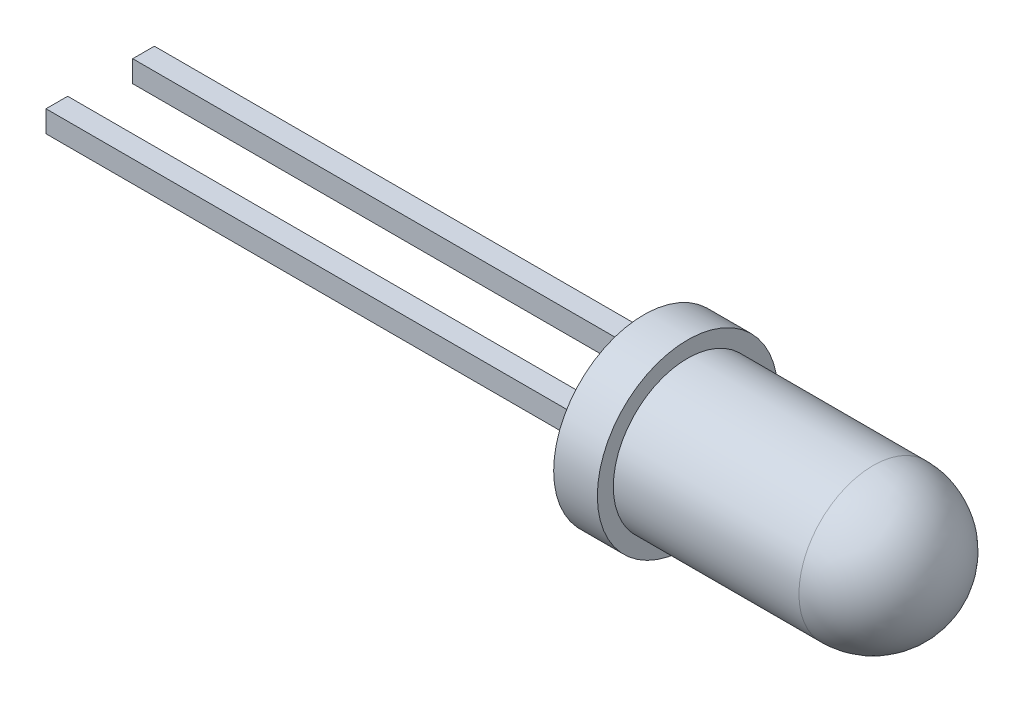
ISO-10303-21;
HEADER;
FILE_DESCRIPTION(('STEP AP214'),'2;1');
FILE_NAME('part.step','',(''),(''),'','','');
FILE_SCHEMA(('AUTOMOTIVE_DESIGN { 1 0 10303 214 1 1 1 1 }'));
ENDSEC;
DATA;
#1=APPLICATION_CONTEXT('core data for automotive mechanical design processes');
#2=APPLICATION_PROTOCOL_DEFINITION('international standard','automotive_design',2000,#1);
#3=PRODUCT_CONTEXT('',#1,'mechanical');
#4=PRODUCT('Part','Part','',(#3));
#5=PRODUCT_RELATED_PRODUCT_CATEGORY('part','',(#4));
#6=PRODUCT_DEFINITION_FORMATION('','',#4);
#7=PRODUCT_DEFINITION_CONTEXT('part definition',#1,'design');
#8=PRODUCT_DEFINITION('design','',#6,#7);
#9=PRODUCT_DEFINITION_SHAPE('','',#8);
#10=(LENGTH_UNIT() NAMED_UNIT(*) SI_UNIT(.MILLI.,.METRE.));
#11=(NAMED_UNIT(*) PLANE_ANGLE_UNIT() SI_UNIT($,.RADIAN.));
#12=(NAMED_UNIT(*) SI_UNIT($,.STERADIAN.) SOLID_ANGLE_UNIT());
#13=UNCERTAINTY_MEASURE_WITH_UNIT(LENGTH_MEASURE(1.E-05),#10,'distance_accuracy_value','');
#14=(GEOMETRIC_REPRESENTATION_CONTEXT(3) GLOBAL_UNCERTAINTY_ASSIGNED_CONTEXT((#13)) GLOBAL_UNIT_ASSIGNED_CONTEXT((#10,
#11,#12)) REPRESENTATION_CONTEXT('',''));
#15=CARTESIAN_POINT('',(0.,0.,0.));
#16=DIRECTION('',(0.,0.,1.));
#17=DIRECTION('',(1.,0.,0.));
#18=AXIS2_PLACEMENT_3D('',#15,#16,#17);
#19=CARTESIAN_POINT('',(36.9246378551169,127.506480985467,120.126510111259));
#20=DIRECTION('',(1.,0.,0.));
#21=DIRECTION('',(0.,0.,-1.));
#22=AXIS2_PLACEMENT_3D('',#19,#20,#21);
#23=PLANE('',#22);
#24=CARTESIAN_POINT('',(36.9246378551169,127.506480985467,119.215722179506));
#25=DIRECTION('',(-1.,0.,0.));
#26=DIRECTION('',(0.,0.,1.));
#27=AXIS2_PLACEMENT_3D('',#24,#25,#26);
#28=CIRCLE('',#27,1.82157586350626);
#29=CARTESIAN_POINT('',(36.9246378551169,127.506480985467,121.037298043012));
#30=VERTEX_POINT('',#29);
#31=EDGE_CURVE('P0_E19',#30,#30,#28,.F.);
#32=ORIENTED_EDGE('',*,*,#31,.F.);
#33=EDGE_LOOP('',(#32));
#34=FACE_BOUND('',#33,.T.);
#35=ADVANCED_FACE('P0_F16',(#34),#23,.F.);
#36=CARTESIAN_POINT('',(37.3657203700618,127.506480985467,119.215722179506));
#37=DIRECTION('',(-1.,0.,0.));
#38=DIRECTION('',(0.,0.,1.));
#39=AXIS2_PLACEMENT_3D('',#36,#37,#38);
#40=CYLINDRICAL_SURFACE('',#39,1.82157586350626);
#41=CARTESIAN_POINT('',(37.8068028850068,127.506480985467,119.215722179506));
#42=DIRECTION('',(-1.,0.,0.));
#43=DIRECTION('',(0.,0.,1.));
#44=AXIS2_PLACEMENT_3D('',#41,#42,#43);
#45=CIRCLE('',#44,1.82157586350626);
#46=CARTESIAN_POINT('',(37.8068028850068,127.506480985467,121.037298043012));
#47=VERTEX_POINT('',#46);
#48=EDGE_CURVE('P0_E40',#47,#47,#45,.T.);
#49=ORIENTED_EDGE('',*,*,#48,.T.);
#50=EDGE_LOOP('',(#49));
#51=FACE_BOUND('',#50,.T.);
#52=ORIENTED_EDGE('',*,*,#31,.T.);
#53=EDGE_LOOP('',(#52));
#54=FACE_BOUND('',#53,.T.);
#55=ADVANCED_FACE('P0_F53',(#51,#54),#40,.T.);
#56=CARTESIAN_POINT('',(37.8068028850068,127.506480985467,120.876048242794));
#57=DIRECTION('',(-1.,0.,0.));
#58=DIRECTION('',(0.,0.,1.));
#59=AXIS2_PLACEMENT_3D('',#56,#57,#58);
#60=PLANE('',#59);
#61=CARTESIAN_POINT('',(37.8068028850068,127.506480985467,119.215722179506));
#62=DIRECTION('',(-1.,0.,0.));
#63=DIRECTION('',(0.,0.,1.));
#64=AXIS2_PLACEMENT_3D('',#61,#62,#63);
#65=CIRCLE('',#64,1.49907626306918);
#66=CARTESIAN_POINT('',(37.8068028850068,127.506480985467,120.714798442575));
#67=VERTEX_POINT('',#66);
#68=EDGE_CURVE('P0_E26',#67,#67,#65,.F.);
#69=ORIENTED_EDGE('',*,*,#68,.F.);
#70=EDGE_LOOP('',(#69));
#71=FACE_BOUND('',#70,.T.);
#72=ORIENTED_EDGE('',*,*,#48,.F.);
#73=EDGE_LOOP('',(#72));
#74=FACE_BOUND('',#73,.T.);
#75=ADVANCED_FACE('P0_F44',(#71,#74),#60,.F.);
#76=CARTESIAN_POINT('',(41.5569484533615,127.506480985467,119.215722179506));
#77=DIRECTION('',(0.,0.,-1.));
#78=DIRECTION('',(0.,1.,0.));
#79=AXIS2_PLACEMENT_3D('',#76,#77,#78);
#80=SPHERICAL_SURFACE('',#79,1.49907626306919);
#81=CARTESIAN_POINT('',(41.5569484533615,127.506480985467,119.215722179506));
#82=DIRECTION('',(-1.,0.,0.));
#83=DIRECTION('',(0.,0.,1.));
#84=AXIS2_PLACEMENT_3D('',#81,#82,#83);
#85=CIRCLE('',#84,1.49907626306918);
#86=CARTESIAN_POINT('',(41.5569484533615,127.506480985467,120.714798442575));
#87=VERTEX_POINT('',#86);
#88=CARTESIAN_POINT('',(41.5569484533615,127.506480985467,117.716645916437));
#89=VERTEX_POINT('',#88);
#90=EDGE_CURVE('P0_E11',#87,#89,#85,.T.);
#91=ORIENTED_EDGE('',*,*,#90,.F.);
#92=CARTESIAN_POINT('',(41.5569484533615,127.506480985467,119.215722179506));
#93=DIRECTION('',(-1.,0.,0.));
#94=DIRECTION('',(0.,0.,1.));
#95=AXIS2_PLACEMENT_3D('',#92,#93,#94);
#96=CIRCLE('',#95,1.49907626306918);
#97=EDGE_CURVE('P0_E35',#89,#87,#96,.T.);
#98=ORIENTED_EDGE('',*,*,#97,.F.);
#99=EDGE_LOOP('',(#91,#98));
#100=FACE_BOUND('',#99,.T.);
#101=ADVANCED_FACE('P0_F42',(#100),#80,.T.);
#102=CARTESIAN_POINT('',(39.6818756691841,127.506480985467,119.215722179506));
#103=DIRECTION('',(-1.,0.,0.));
#104=DIRECTION('',(0.,0.,1.));
#105=AXIS2_PLACEMENT_3D('',#102,#103,#104);
#106=CYLINDRICAL_SURFACE('',#105,1.49907626306918);
#107=ORIENTED_EDGE('',*,*,#97,.T.);
#108=ORIENTED_EDGE('',*,*,#90,.T.);
#109=EDGE_LOOP('',(#107,#108));
#110=FACE_BOUND('',#109,.T.);
#111=ORIENTED_EDGE('',*,*,#68,.T.);
#112=EDGE_LOOP('',(#111));
#113=FACE_BOUND('',#112,.T.);
#114=ADVANCED_FACE('P0_F37',(#110,#113),#106,.T.);
#115=CLOSED_SHELL('',(#35,#55,#75,#101,#114));
#116=MANIFOLD_SOLID_BREP('P0_B1',#115);
#117=CARTESIAN_POINT('',(35.643783620503,127.363942335767,119.800951466133));
#118=DIRECTION('',(0.,-1.,0.));
#119=DIRECTION('',(1.,0.,0.));
#120=AXIS2_PLACEMENT_3D('',#117,#118,#119);
#121=PLANE('',#120);
#122=DIRECTION('',(1.,0.,0.));
#123=VECTOR('',#122,1.);
#124=CARTESIAN_POINT('',(38.044409463769,127.363942335767,120.125625338751));
#125=LINE('',#124,#123);
#126=CARTESIAN_POINT('',(25.756754643438,127.363942335767,120.125625338751));
#127=VERTEX_POINT('',#126);
#128=CARTESIAN_POINT('',(38.044409463769,127.363942335767,120.12562533875));
#129=VERTEX_POINT('',#128);
#130=EDGE_CURVE('P1_E120',#127,#129,#125,.T.);
#131=ORIENTED_EDGE('',*,*,#130,.F.);
#132=DIRECTION('',(0.,0.,1.));
#133=VECTOR('',#132,1.);
#134=CARTESIAN_POINT('',(25.756754643438,127.363942335767,120.125625338751));
#135=LINE('',#134,#133);
#136=CARTESIAN_POINT('',(25.756754643438,127.363942335767,119.687669134371));
#137=VERTEX_POINT('',#136);
#138=EDGE_CURVE('P1_E19',#137,#127,#135,.T.);
#139=ORIENTED_EDGE('',*,*,#138,.F.);
#140=DIRECTION('',(-1.,0.,0.));
#141=VECTOR('',#140,1.);
#142=CARTESIAN_POINT('',(36.918952053102,127.363942335767,119.687669134371));
#143=LINE('',#142,#141);
#144=CARTESIAN_POINT('',(38.176257537891,127.363942335767,119.687669134371));
#145=VERTEX_POINT('',#144);
#146=EDGE_CURVE('P1_E109',#145,#137,#143,.T.);
#147=ORIENTED_EDGE('',*,*,#146,.F.);
#148=DIRECTION('',(0.,0.,1.));
#149=VECTOR('',#148,1.);
#150=CARTESIAN_POINT('',(38.176257537891,127.363942335767,119.352734373899));
#151=LINE('',#150,#149);
#152=CARTESIAN_POINT('',(38.1762575378911,127.363942335767,119.352734373899));
#153=VERTEX_POINT('',#152);
#154=EDGE_CURVE('P1_E103',#153,#145,#151,.T.);
#155=ORIENTED_EDGE('',*,*,#154,.F.);
#156=DIRECTION('',(-0.772727558068304,0.,-0.634737836434694));
#157=VECTOR('',#156,1.);
#158=CARTESIAN_POINT('',(38.939781138572,127.363942335767,119.979911848421));
#159=LINE('',#158,#157);
#160=CARTESIAN_POINT('',(38.939781138572,127.363942335767,119.979911848421));
#161=VERTEX_POINT('',#160);
#162=EDGE_CURVE('P1_E137',#161,#153,#159,.T.);
#163=ORIENTED_EDGE('',*,*,#162,.F.);
#164=DIRECTION('',(-1.,0.,0.));
#165=VECTOR('',#164,1.);
#166=CARTESIAN_POINT('',(39.34696797288,127.363942335767,119.979911848421));
#167=LINE('',#166,#165);
#168=CARTESIAN_POINT('',(39.34696797288,127.363942335767,119.979911848421));
#169=VERTEX_POINT('',#168);
#170=EDGE_CURVE('P1_E143',#169,#161,#167,.T.);
#171=ORIENTED_EDGE('',*,*,#170,.F.);
#172=DIRECTION('',(0.,0.,-1.));
#173=VECTOR('',#172,1.);
#174=CARTESIAN_POINT('',(39.34696797288,127.363942335767,119.979911848421));
#175=LINE('',#174,#173);
#176=CARTESIAN_POINT('',(39.34696797288,127.363942335767,120.382400068216));
#177=VERTEX_POINT('',#176);
#178=EDGE_CURVE('P1_E152',#177,#169,#175,.T.);
#179=ORIENTED_EDGE('',*,*,#178,.F.);
#180=DIRECTION('',(1.,0.,0.));
#181=VECTOR('',#180,1.);
#182=CARTESIAN_POINT('',(39.34696797288,127.363942335767,120.382400068216));
#183=LINE('',#182,#181);
#184=CARTESIAN_POINT('',(38.357006095456,127.363942335767,120.382400068216));
#185=VERTEX_POINT('',#184);
#186=EDGE_CURVE('P1_E159',#185,#177,#183,.T.);
#187=ORIENTED_EDGE('',*,*,#186,.F.);
#188=DIRECTION('',(0.772727558068304,0.,0.634737836434694));
#189=VECTOR('',#188,1.);
#190=CARTESIAN_POINT('',(38.357006095456,127.363942335767,120.382400068216));
#191=LINE('',#190,#189);
#192=EDGE_CURVE('P1_E166',#129,#185,#191,.T.);
#193=ORIENTED_EDGE('',*,*,#192,.F.);
#194=EDGE_LOOP('',(#131,#139,#147,#155,#163,#171,#179,#187,#193));
#195=FACE_BOUND('',#194,.T.);
#196=ADVANCED_FACE('P1_F16',(#195),#121,.T.);
#197=CARTESIAN_POINT('',(25.756754643438,127.582920437956,120.125625338751));
#198=DIRECTION('',(-1.,0.,0.));
#199=DIRECTION('',(0.,0.,1.));
#200=AXIS2_PLACEMENT_3D('',#197,#198,#199);
#201=PLANE('',#200);
#202=DIRECTION('',(0.,1.,0.));
#203=VECTOR('',#202,1.);
#204=CARTESIAN_POINT('',(25.756754643438,127.582920437956,119.687669134371));
#205=LINE('',#204,#203);
#206=CARTESIAN_POINT('',(25.756754643438,127.801898540146,119.687669134371));
#207=VERTEX_POINT('',#206);
#208=EDGE_CURVE('P1_E114',#137,#207,#205,.T.);
#209=ORIENTED_EDGE('',*,*,#208,.F.);
#210=ORIENTED_EDGE('',*,*,#138,.T.);
#211=DIRECTION('',(0.,1.,0.));
#212=VECTOR('',#211,1.);
#213=CARTESIAN_POINT('',(25.756754643438,127.582920437956,120.125625338751));
#214=LINE('',#213,#212);
#215=CARTESIAN_POINT('',(25.756754643438,127.801898540146,120.125625338751));
#216=VERTEX_POINT('',#215);
#217=EDGE_CURVE('P1_E172',#216,#127,#214,.F.);
#218=ORIENTED_EDGE('',*,*,#217,.F.);
#219=DIRECTION('',(0.,0.,1.));
#220=VECTOR('',#219,1.);
#221=CARTESIAN_POINT('',(25.756754643438,127.801898540146,119.800951466133));
#222=LINE('',#221,#220);
#223=EDGE_CURVE('P1_E127',#216,#207,#222,.F.);
#224=ORIENTED_EDGE('',*,*,#223,.T.);
#225=EDGE_LOOP('',(#209,#210,#218,#224));
#226=FACE_BOUND('',#225,.T.);
#227=ADVANCED_FACE('P1_F126',(#226),#201,.T.);
#228=CARTESIAN_POINT('',(36.918952053102,127.582920437956,119.687669134371));
#229=DIRECTION('',(0.,0.,-1.));
#230=DIRECTION('',(-1.,0.,0.));
#231=AXIS2_PLACEMENT_3D('',#228,#229,#230);
#232=PLANE('',#231);
#233=ORIENTED_EDGE('',*,*,#146,.T.);
#234=ORIENTED_EDGE('',*,*,#208,.T.);
#235=DIRECTION('',(1.,0.,0.));
#236=VECTOR('',#235,1.);
#237=CARTESIAN_POINT('',(35.643783620503,127.801898540146,119.687669134371));
#238=LINE('',#237,#236);
#239=CARTESIAN_POINT('',(38.176257537891,127.801898540146,119.687669134371));
#240=VERTEX_POINT('',#239);
#241=EDGE_CURVE('P1_E178',#207,#240,#238,.T.);
#242=ORIENTED_EDGE('',*,*,#241,.T.);
#243=DIRECTION('',(0.,1.,0.));
#244=VECTOR('',#243,1.);
#245=CARTESIAN_POINT('',(38.176257537891,127.582920437956,119.687669134371));
#246=LINE('',#245,#244);
#247=EDGE_CURVE('P1_E116',#145,#240,#246,.T.);
#248=ORIENTED_EDGE('',*,*,#247,.F.);
#249=EDGE_LOOP('',(#233,#234,#242,#248));
#250=FACE_BOUND('',#249,.T.);
#251=ADVANCED_FACE('P1_F111',(#250),#232,.T.);
#252=CARTESIAN_POINT('',(38.176257537891,127.582920437956,119.352734373899));
#253=DIRECTION('',(-1.,0.,0.));
#254=DIRECTION('',(0.,0.,1.));
#255=AXIS2_PLACEMENT_3D('',#252,#253,#254);
#256=PLANE('',#255);
#257=ORIENTED_EDGE('',*,*,#247,.T.);
#258=DIRECTION('',(0.,0.,1.));
#259=VECTOR('',#258,1.);
#260=CARTESIAN_POINT('',(38.176257537891,127.801898540146,119.800951466133));
#261=LINE('',#260,#259);
#262=CARTESIAN_POINT('',(38.1762575378911,127.801898540146,119.352734373899));
#263=VERTEX_POINT('',#262);
#264=EDGE_CURVE('P1_E181',#240,#263,#261,.F.);
#265=ORIENTED_EDGE('',*,*,#264,.T.);
#266=DIRECTION('',(0.,1.,0.));
#267=VECTOR('',#266,1.);
#268=CARTESIAN_POINT('',(38.1762575378912,127.582920437956,119.352734373898));
#269=LINE('',#268,#267);
#270=EDGE_CURVE('P1_E140',#153,#263,#269,.T.);
#271=ORIENTED_EDGE('',*,*,#270,.F.);
#272=ORIENTED_EDGE('',*,*,#154,.T.);
#273=EDGE_LOOP('',(#257,#265,#271,#272));
#274=FACE_BOUND('',#273,.T.);
#275=ADVANCED_FACE('P1_F226',(#274),#256,.T.);
#276=CARTESIAN_POINT('',(38.939781138572,127.582920437956,119.979911848421));
#277=DIRECTION('',(0.634737836434694,0.,-0.772727558068304));
#278=DIRECTION('',(-0.772727558068304,0.,-0.634737836434694));
#279=AXIS2_PLACEMENT_3D('',#276,#277,#278);
#280=PLANE('',#279);
#281=ORIENTED_EDGE('',*,*,#270,.T.);
#282=DIRECTION('',(0.772727558068519,0.,0.634737836434431));
#283=VECTOR('',#282,1.);
#284=CARTESIAN_POINT('',(38.176257537891,127.801898540146,119.352734373899));
#285=LINE('',#284,#283);
#286=CARTESIAN_POINT('',(38.939781138572,127.801898540146,119.979911848421));
#287=VERTEX_POINT('',#286);
#288=EDGE_CURVE('P1_E185',#263,#287,#285,.T.);
#289=ORIENTED_EDGE('',*,*,#288,.T.);
#290=DIRECTION('',(0.,1.,0.));
#291=VECTOR('',#290,1.);
#292=CARTESIAN_POINT('',(38.939781138572,127.582920437956,119.979911848421));
#293=LINE('',#292,#291);
#294=EDGE_CURVE('P1_E146',#161,#287,#293,.T.);
#295=ORIENTED_EDGE('',*,*,#294,.F.);
#296=ORIENTED_EDGE('',*,*,#162,.T.);
#297=EDGE_LOOP('',(#281,#289,#295,#296));
#298=FACE_BOUND('',#297,.T.);
#299=ADVANCED_FACE('P1_F224',(#298),#280,.T.);
#300=CARTESIAN_POINT('',(39.34696797288,127.582920437956,119.979911848421));
#301=DIRECTION('',(0.,0.,-1.));
#302=DIRECTION('',(-1.,0.,0.));
#303=AXIS2_PLACEMENT_3D('',#300,#301,#302);
#304=PLANE('',#303);
#305=ORIENTED_EDGE('',*,*,#294,.T.);
#306=DIRECTION('',(1.,0.,0.));
#307=VECTOR('',#306,1.);
#308=CARTESIAN_POINT('',(35.643783620503,127.801898540146,119.979911848421));
#309=LINE('',#308,#307);
#310=CARTESIAN_POINT('',(39.34696797288,127.801898540146,119.979911848421));
#311=VERTEX_POINT('',#310);
#312=EDGE_CURVE('P1_E189',#287,#311,#309,.T.);
#313=ORIENTED_EDGE('',*,*,#312,.T.);
#314=DIRECTION('',(0.,1.,0.));
#315=VECTOR('',#314,1.);
#316=CARTESIAN_POINT('',(39.34696797288,127.582920437956,119.979911848421));
#317=LINE('',#316,#315);
#318=EDGE_CURVE('P1_E149',#169,#311,#317,.T.);
#319=ORIENTED_EDGE('',*,*,#318,.F.);
#320=ORIENTED_EDGE('',*,*,#170,.T.);
#321=EDGE_LOOP('',(#305,#313,#319,#320));
#322=FACE_BOUND('',#321,.T.);
#323=ADVANCED_FACE('P1_F220',(#322),#304,.T.);
#324=CARTESIAN_POINT('',(39.34696797288,127.582920437956,119.979911848421));
#325=DIRECTION('',(1.,0.,0.));
#326=DIRECTION('',(0.,0.,-1.));
#327=AXIS2_PLACEMENT_3D('',#324,#325,#326);
#328=PLANE('',#327);
#329=DIRECTION('',(0.,1.,0.));
#330=VECTOR('',#329,1.);
#331=CARTESIAN_POINT('',(39.34696797288,127.582920437956,120.382400068216));
#332=LINE('',#331,#330);
#333=CARTESIAN_POINT('',(39.34696797288,127.801898540146,120.382400068216));
#334=VERTEX_POINT('',#333);
#335=EDGE_CURVE('P1_E156',#177,#334,#332,.T.);
#336=ORIENTED_EDGE('',*,*,#335,.F.);
#337=ORIENTED_EDGE('',*,*,#178,.T.);
#338=ORIENTED_EDGE('',*,*,#318,.T.);
#339=DIRECTION('',(0.,0.,1.));
#340=VECTOR('',#339,1.);
#341=CARTESIAN_POINT('',(39.34696797288,127.801898540146,119.800951466133));
#342=LINE('',#341,#340);
#343=EDGE_CURVE('P1_E193',#311,#334,#342,.T.);
#344=ORIENTED_EDGE('',*,*,#343,.T.);
#345=EDGE_LOOP('',(#336,#337,#338,#344));
#346=FACE_BOUND('',#345,.T.);
#347=ADVANCED_FACE('P1_F215',(#346),#328,.T.);
#348=CARTESIAN_POINT('',(39.34696797288,127.582920437956,120.382400068216));
#349=DIRECTION('',(0.,0.,1.));
#350=DIRECTION('',(1.,0.,0.));
#351=AXIS2_PLACEMENT_3D('',#348,#349,#350);
#352=PLANE('',#351);
#353=DIRECTION('',(0.,1.,0.));
#354=VECTOR('',#353,1.);
#355=CARTESIAN_POINT('',(38.357006095456,127.582920437956,120.382400068216));
#356=LINE('',#355,#354);
#357=CARTESIAN_POINT('',(38.357006095456,127.801898540146,120.382400068216));
#358=VERTEX_POINT('',#357);
#359=EDGE_CURVE('P1_E163',#185,#358,#356,.T.);
#360=ORIENTED_EDGE('',*,*,#359,.F.);
#361=ORIENTED_EDGE('',*,*,#186,.T.);
#362=ORIENTED_EDGE('',*,*,#335,.T.);
#363=DIRECTION('',(1.,0.,0.));
#364=VECTOR('',#363,1.);
#365=CARTESIAN_POINT('',(35.643783620503,127.801898540146,120.382400068216));
#366=LINE('',#365,#364);
#367=EDGE_CURVE('P1_E197',#334,#358,#366,.F.);
#368=ORIENTED_EDGE('',*,*,#367,.T.);
#369=EDGE_LOOP('',(#360,#361,#362,#368));
#370=FACE_BOUND('',#369,.T.);
#371=ADVANCED_FACE('P1_F212',(#370),#352,.T.);
#372=CARTESIAN_POINT('',(38.357006095456,127.582920437956,120.382400068216));
#373=DIRECTION('',(-0.634737836434694,0.,0.772727558068304));
#374=DIRECTION('',(0.772727558068304,0.,0.634737836434694));
#375=AXIS2_PLACEMENT_3D('',#372,#373,#374);
#376=PLANE('',#375);
#377=DIRECTION('',(0.,1.,0.));
#378=VECTOR('',#377,1.);
#379=CARTESIAN_POINT('',(38.044409463769,127.582920437956,120.125625338751));
#380=LINE('',#379,#378);
#381=CARTESIAN_POINT('',(38.044409463769,127.801898540146,120.12562533875));
#382=VERTEX_POINT('',#381);
#383=EDGE_CURVE('P1_E38',#129,#382,#380,.T.);
#384=ORIENTED_EDGE('',*,*,#383,.F.);
#385=ORIENTED_EDGE('',*,*,#192,.T.);
#386=ORIENTED_EDGE('',*,*,#359,.T.);
#387=DIRECTION('',(-0.772727558068343,0.,-0.634737836434646));
#388=VECTOR('',#387,1.);
#389=CARTESIAN_POINT('',(38.357006095456,127.801898540146,120.382400068216));
#390=LINE('',#389,#388);
#391=EDGE_CURVE('P1_E26',#358,#382,#390,.T.);
#392=ORIENTED_EDGE('',*,*,#391,.T.);
#393=EDGE_LOOP('',(#384,#385,#386,#392));
#394=FACE_BOUND('',#393,.T.);
#395=ADVANCED_FACE('P1_F205',(#394),#376,.T.);
#396=CARTESIAN_POINT('',(38.044409463769,127.582920437956,120.125625338751));
#397=DIRECTION('',(0.,0.,1.));
#398=DIRECTION('',(1.,0.,0.));
#399=AXIS2_PLACEMENT_3D('',#396,#397,#398);
#400=PLANE('',#399);
#401=ORIENTED_EDGE('',*,*,#217,.T.);
#402=ORIENTED_EDGE('',*,*,#130,.T.);
#403=ORIENTED_EDGE('',*,*,#383,.T.);
#404=DIRECTION('',(1.,0.,0.));
#405=VECTOR('',#404,1.);
#406=CARTESIAN_POINT('',(35.643783620503,127.801898540146,120.125625338751));
#407=LINE('',#406,#405);
#408=EDGE_CURVE('P1_E11',#382,#216,#407,.F.);
#409=ORIENTED_EDGE('',*,*,#408,.T.);
#410=EDGE_LOOP('',(#401,#402,#403,#409));
#411=FACE_BOUND('',#410,.T.);
#412=ADVANCED_FACE('P1_F238',(#411),#400,.T.);
#413=CARTESIAN_POINT('',(35.643783620503,127.801898540146,119.800951466133));
#414=DIRECTION('',(0.,-1.,0.));
#415=DIRECTION('',(1.,0.,0.));
#416=AXIS2_PLACEMENT_3D('',#413,#414,#415);
#417=PLANE('',#416);
#418=ORIENTED_EDGE('',*,*,#391,.F.);
#419=ORIENTED_EDGE('',*,*,#367,.F.);
#420=ORIENTED_EDGE('',*,*,#343,.F.);
#421=ORIENTED_EDGE('',*,*,#312,.F.);
#422=ORIENTED_EDGE('',*,*,#288,.F.);
#423=ORIENTED_EDGE('',*,*,#264,.F.);
#424=ORIENTED_EDGE('',*,*,#241,.F.);
#425=ORIENTED_EDGE('',*,*,#223,.F.);
#426=ORIENTED_EDGE('',*,*,#408,.F.);
#427=EDGE_LOOP('',(#418,#419,#420,#421,#422,#423,#424,#425,#426));
#428=FACE_BOUND('',#427,.T.);
#429=ADVANCED_FACE('P1_F209',(#428),#417,.F.);
#430=CLOSED_SHELL('',(#196,#227,#251,#275,#299,#323,#347,#371,#395,#412,#429));
#431=MANIFOLD_SOLID_BREP('P1_B1',#430);
#432=CARTESIAN_POINT('',(39.0630461134621,127.582920437956,118.997137994981));
#433=DIRECTION('',(1.,0.,0.));
#434=DIRECTION('',(0.,0.,-1.));
#435=AXIS2_PLACEMENT_3D('',#432,#433,#434);
#436=CONICAL_SURFACE('',#435,0.495180774396115,0.948444638350722);
#437=CARTESIAN_POINT('',(39.063046113481,127.363942335767,118.553006719209));
#438=CARTESIAN_POINT('',(39.0523469411574,127.363942335767,118.569643969917));
#439=CARTESIAN_POINT('',(39.0417209132437,127.363942335767,118.586329744709));
#440=CARTESIAN_POINT('',(39.0206914898148,127.363942335767,118.619856319092));
#441=CARTESIAN_POINT('',(39.0102882481465,127.363942335767,118.636697215009));
#442=CARTESIAN_POINT('',(38.9895033918301,127.363942335767,118.671052333609));
#443=CARTESIAN_POINT('',(38.9791308362053,127.363942335767,118.688572070525));
#444=CARTESIAN_POINT('',(38.9588859874997,127.363942335767,118.723893907215));
#445=CARTESIAN_POINT('',(38.9490135513687,127.363942335767,118.741695924312));
#446=CARTESIAN_POINT('',(38.9256580230354,127.363942335767,118.785949032287));
#447=CARTESIAN_POINT('',(38.9125942592863,127.363942335767,118.812624177516));
#448=CARTESIAN_POINT('',(38.8897756650775,127.363942335767,118.867189381756));
#449=CARTESIAN_POINT('',(38.8799891021635,127.363942335767,118.895064653078));
#450=CARTESIAN_POINT('',(38.8691491274309,127.363942335767,118.942752721611));
#451=CARTESIAN_POINT('',(38.8662630929884,127.363942335767,118.962111765676));
#452=CARTESIAN_POINT('',(38.8642927189763,127.363942335767,119.000985940596));
#453=CARTESIAN_POINT('',(38.8651972031943,127.363942335767,119.020500443499));
#454=CARTESIAN_POINT('',(38.8712564700552,127.363942335767,119.064848006759));
#455=CARTESIAN_POINT('',(38.877616534415,127.363942335767,119.089500137079));
#456=CARTESIAN_POINT('',(38.8938921734001,127.363942335767,119.137915704708));
#457=CARTESIAN_POINT('',(38.9038643913913,127.363942335767,119.1616579149));
#458=CARTESIAN_POINT('',(38.9254980569867,127.363942335767,119.207945540536));
#459=CARTESIAN_POINT('',(38.9371351973577,127.363942335767,119.230502695674));
#460=CARTESIAN_POINT('',(38.9614263066404,127.363942335767,119.275078742736));
#461=CARTESIAN_POINT('',(38.9740812038007,127.363942335767,119.297097118843));
#462=CARTESIAN_POINT('',(38.999294912405,127.363942335767,119.33960484109));
#463=CARTESIAN_POINT('',(39.0118225181786,127.363942335767,119.360112886079));
#464=CARTESIAN_POINT('',(39.0372167716169,127.363942335767,119.400858905228));
#465=CARTESIAN_POINT('',(39.0500826522836,127.363942335767,119.421097355984));
#466=CARTESIAN_POINT('',(39.063046113481,127.363942335767,119.441269270754));
#467=B_SPLINE_CURVE_WITH_KNOTS('',3,(#437,#438,#439,#440,#441,#442,#443,#444,#445,#446,#447,
#448,#449,#450,#451,#452,#453,#454,#455,#456,#457,#458,#459,#460,#461,#462,#463,#464,#465,#466),
.UNSPECIFIED.,.F.,.F.,(4,2,2,2,2,2,2,2,2,2,2,2,2,2,4),(0.,0.0593433450649417,0.118726428371468,
0.179801216358725,0.24085843518063,0.329903751847133,0.418060090801287,0.476466366540428,
0.534700554754461,0.610587269571514,0.687719515122809,0.763822883660381,0.839996467302433,
0.912087216264806,0.984026618242292),.UNSPECIFIED.);
#468=CARTESIAN_POINT('',(39.0630461134716,127.363942335767,118.553006719224));
#469=VERTEX_POINT('',#468);
#470=CARTESIAN_POINT('',(39.0630461134715,127.363942335767,119.441269270739));
#471=VERTEX_POINT('',#470);
#472=EDGE_CURVE('P2_E20',#469,#471,#467,.T.);
#473=ORIENTED_EDGE('',*,*,#472,.F.);
#474=CARTESIAN_POINT('',(39.0630461134621,127.582920437956,118.997137994981));
#475=DIRECTION('',(1.,0.,0.));
#476=DIRECTION('',(0.,0.,-1.));
#477=AXIS2_PLACEMENT_3D('',#474,#475,#476);
#478=CIRCLE('',#477,0.495180774396116);
#479=EDGE_CURVE('P2_E123',#471,#469,#478,.T.);
#480=ORIENTED_EDGE('',*,*,#479,.F.);
#481=EDGE_LOOP('',(#473,#480));
#482=FACE_BOUND('',#481,.T.);
#483=ADVANCED_FACE('P2_F16',(#482),#436,.T.);
#484=CARTESIAN_POINT('',(39.0630461134052,127.582920437956,118.997137994981));
#485=DIRECTION('',(1.,0.,0.));
#486=DIRECTION('',(0.,0.,-1.));
#487=AXIS2_PLACEMENT_3D('',#484,#485,#486);
#488=CONICAL_SURFACE('',#487,0.320240853556836,0.948444638403989);
#489=CARTESIAN_POINT('',(38.8332844299626,127.582920437956,118.997137995083));
#490=VERTEX_POINT('',#489);
#491=VERTEX_LOOP('',#490);
#492=FACE_BOUND('',#491,.T.);
#493=CARTESIAN_POINT('',(39.0630461134952,127.582920437956,118.997137994981));
#494=DIRECTION('',(1.,0.,0.));
#495=DIRECTION('',(0.,0.,-1.));
#496=AXIS2_PLACEMENT_3D('',#493,#494,#495);
#497=CIRCLE('',#496,0.320240853682208);
#498=CARTESIAN_POINT('',(39.0630461134952,127.582920437956,118.676897141299));
#499=VERTEX_POINT('',#498);
#500=EDGE_CURVE('P2_E136',#499,#499,#497,.F.);
#501=ORIENTED_EDGE('',*,*,#500,.F.);
#502=EDGE_LOOP('',(#501));
#503=FACE_BOUND('',#502,.T.);
#504=ADVANCED_FACE('P2_F341',(#492,#503),#488,.F.);
#505=CARTESIAN_POINT('',(36.629185080357,127.363942335767,118.049126648615));
#506=DIRECTION('',(0.,-1.,0.));
#507=DIRECTION('',(1.,0.,0.));
#508=AXIS2_PLACEMENT_3D('',#505,#506,#507);
#509=PLANE('',#508);
#510=DIRECTION('',(1.,0.,0.));
#511=VECTOR('',#510,1.);
#512=CARTESIAN_POINT('',(38.176257537891,127.363942335767,118.373800521232));
#513=LINE('',#512,#511);
#514=CARTESIAN_POINT('',(25.756754643438,127.363942335767,118.373800521232));
#515=VERTEX_POINT('',#514);
#516=CARTESIAN_POINT('',(38.176257537891,127.363942335767,118.373800521232));
#517=VERTEX_POINT('',#516);
#518=EDGE_CURVE('P2_E203',#515,#517,#513,.T.);
#519=ORIENTED_EDGE('',*,*,#518,.F.);
#520=DIRECTION('',(0.,0.,1.));
#521=VECTOR('',#520,1.);
#522=CARTESIAN_POINT('',(25.756754643438,127.363942335767,120.125625338751));
#523=LINE('',#522,#521);
#524=CARTESIAN_POINT('',(25.756754643438,127.363942335767,117.935844316853));
#525=VERTEX_POINT('',#524);
#526=EDGE_CURVE('P2_E128',#525,#515,#523,.T.);
#527=ORIENTED_EDGE('',*,*,#526,.F.);
#528=DIRECTION('',(-1.,0.,0.));
#529=VECTOR('',#528,1.);
#530=CARTESIAN_POINT('',(36.933056541737,127.363942335767,117.935844316853));
#531=LINE('',#530,#529);
#532=CARTESIAN_POINT('',(38.429623073374,127.363942335767,117.935844316853));
#533=VERTEX_POINT('',#532);
#534=EDGE_CURVE('P2_E197',#533,#525,#531,.T.);
#535=ORIENTED_EDGE('',*,*,#534,.F.);
#536=DIRECTION('',(-0.863643807025926,0.,-0.504102543720784));
#537=VECTOR('',#536,1.);
#538=CARTESIAN_POINT('',(38.429623073374,127.363942335767,117.935844316853));
#539=LINE('',#538,#537);
#540=CARTESIAN_POINT('',(39.063046113489,127.363942335767,118.305568690693));
#541=VERTEX_POINT('',#540);
#542=EDGE_CURVE('P2_E141',#541,#533,#539,.T.);
#543=ORIENTED_EDGE('',*,*,#542,.F.);
#544=DIRECTION('',(0.,0.,-1.));
#545=VECTOR('',#544,1.);
#546=CARTESIAN_POINT('',(39.063046113489,127.363942335767,119.68870729927));
#547=LINE('',#546,#545);
#548=EDGE_CURVE('P2_E131',#469,#541,#547,.T.);
#549=ORIENTED_EDGE('',*,*,#548,.F.);
#550=ORIENTED_EDGE('',*,*,#472,.T.);
#551=DIRECTION('',(0.,0.,-1.));
#552=VECTOR('',#551,1.);
#553=CARTESIAN_POINT('',(39.063046113489,127.363942335767,119.68870729927));
#554=LINE('',#553,#552);
#555=CARTESIAN_POINT('',(39.063046113489,127.363942335767,119.68870729927));
#556=VERTEX_POINT('',#555);
#557=EDGE_CURVE('P2_E134',#556,#471,#554,.T.);
#558=ORIENTED_EDGE('',*,*,#557,.F.);
#559=DIRECTION('',(1.,0.,0.));
#560=VECTOR('',#559,1.);
#561=CARTESIAN_POINT('',(39.063046113489,127.363942335767,119.68870729927));
#562=LINE('',#561,#560);
#563=CARTESIAN_POINT('',(38.972652930809,127.363942335767,119.68870729927));
#564=VERTEX_POINT('',#563);
#565=EDGE_CURVE('P2_E171',#564,#556,#562,.T.);
#566=ORIENTED_EDGE('',*,*,#565,.F.);
#567=DIRECTION('',(0.772727558068304,0.,0.634737836434694));
#568=VECTOR('',#567,1.);
#569=CARTESIAN_POINT('',(38.176257537891,127.363942335767,119.034528108468));
#570=LINE('',#569,#568);
#571=CARTESIAN_POINT('',(38.176257537891,127.363942335767,119.034528108468));
#572=VERTEX_POINT('',#571);
#573=EDGE_CURVE('P2_E225',#572,#564,#570,.T.);
#574=ORIENTED_EDGE('',*,*,#573,.F.);
#575=DIRECTION('',(0.,0.,1.));
#576=VECTOR('',#575,1.);
#577=CARTESIAN_POINT('',(38.176257537891,127.363942335767,118.373800521232));
#578=LINE('',#577,#576);
#579=EDGE_CURVE('P2_E288',#517,#572,#578,.T.);
#580=ORIENTED_EDGE('',*,*,#579,.F.);
#581=EDGE_LOOP('',(#519,#527,#535,#543,#549,#550,#558,#566,#574,#580));
#582=FACE_BOUND('',#581,.T.);
#583=ADVANCED_FACE('P2_F139',(#582),#509,.T.);
#584=CARTESIAN_POINT('',(25.756754643438,127.582920437956,120.125625338751));
#585=DIRECTION('',(-1.,0.,0.));
#586=DIRECTION('',(0.,0.,1.));
#587=AXIS2_PLACEMENT_3D('',#584,#585,#586);
#588=PLANE('',#587);
#589=DIRECTION('',(0.,1.,0.));
#590=VECTOR('',#589,1.);
#591=CARTESIAN_POINT('',(25.756754643438,127.582920437956,117.935844316853));
#592=LINE('',#591,#590);
#593=CARTESIAN_POINT('',(25.756754643438,127.801898540146,117.935844316853));
#594=VERTEX_POINT('',#593);
#595=EDGE_CURVE('P2_E186',#525,#594,#592,.T.);
#596=ORIENTED_EDGE('',*,*,#595,.F.);
#597=ORIENTED_EDGE('',*,*,#526,.T.);
#598=DIRECTION('',(0.,1.,0.));
#599=VECTOR('',#598,1.);
#600=CARTESIAN_POINT('',(25.756754643438,127.582920437956,118.373800521232));
#601=LINE('',#600,#599);
#602=CARTESIAN_POINT('',(25.756754643438,127.801898540146,118.373800521232));
#603=VERTEX_POINT('',#602);
#604=EDGE_CURVE('P2_E206',#603,#515,#601,.F.);
#605=ORIENTED_EDGE('',*,*,#604,.F.);
#606=DIRECTION('',(0.,0.,1.));
#607=VECTOR('',#606,1.);
#608=CARTESIAN_POINT('',(25.756754643438,127.801898540146,118.049126648615));
#609=LINE('',#608,#607);
#610=EDGE_CURVE('P2_E192',#603,#594,#609,.F.);
#611=ORIENTED_EDGE('',*,*,#610,.T.);
#612=EDGE_LOOP('',(#596,#597,#605,#611));
#613=FACE_BOUND('',#612,.T.);
#614=ADVANCED_FACE('P2_F330',(#613),#588,.T.);
#615=CARTESIAN_POINT('',(36.933056541737,127.582920437956,117.935844316853));
#616=DIRECTION('',(0.,0.,-1.));
#617=DIRECTION('',(-1.,0.,0.));
#618=AXIS2_PLACEMENT_3D('',#615,#616,#617);
#619=PLANE('',#618);
#620=ORIENTED_EDGE('',*,*,#534,.T.);
#621=ORIENTED_EDGE('',*,*,#595,.T.);
#622=DIRECTION('',(1.,0.,0.));
#623=VECTOR('',#622,1.);
#624=CARTESIAN_POINT('',(36.629185080357,127.801898540146,117.935844316853));
#625=LINE('',#624,#623);
#626=CARTESIAN_POINT('',(38.429623073374,127.801898540146,117.935844316853));
#627=VERTEX_POINT('',#626);
#628=EDGE_CURVE('P2_E181',#594,#627,#625,.T.);
#629=ORIENTED_EDGE('',*,*,#628,.T.);
#630=DIRECTION('',(0.,1.,0.));
#631=VECTOR('',#630,1.);
#632=CARTESIAN_POINT('',(38.429623073374,127.582920437956,117.935844316853));
#633=LINE('',#632,#631);
#634=EDGE_CURVE('P2_E152',#533,#627,#633,.T.);
#635=ORIENTED_EDGE('',*,*,#634,.F.);
#636=EDGE_LOOP('',(#620,#621,#629,#635));
#637=FACE_BOUND('',#636,.T.);
#638=ADVANCED_FACE('P2_F326',(#637),#619,.T.);
#639=CARTESIAN_POINT('',(38.429623073374,127.582920437956,117.935844316853));
#640=DIRECTION('',(0.504102543720784,0.,-0.863643807025926));
#641=DIRECTION('',(-0.863643807025926,0.,-0.504102543720784));
#642=AXIS2_PLACEMENT_3D('',#639,#640,#641);
#643=PLANE('',#642);
#644=DIRECTION('',(0.,1.,0.));
#645=VECTOR('',#644,1.);
#646=CARTESIAN_POINT('',(39.063046113489,127.582920437956,118.305568690693));
#647=LINE('',#646,#645);
#648=CARTESIAN_POINT('',(39.063046113489,127.801898540146,118.305568690693));
#649=VERTEX_POINT('',#648);
#650=EDGE_CURVE('P2_E144',#541,#649,#647,.T.);
#651=ORIENTED_EDGE('',*,*,#650,.F.);
#652=ORIENTED_EDGE('',*,*,#542,.T.);
#653=ORIENTED_EDGE('',*,*,#634,.T.);
#654=DIRECTION('',(0.863643807025955,0.,0.504102543720734));
#655=VECTOR('',#654,1.);
#656=CARTESIAN_POINT('',(38.429623073374,127.801898540146,117.935844316853));
#657=LINE('',#656,#655);
#658=EDGE_CURVE('P2_E176',#627,#649,#657,.T.);
#659=ORIENTED_EDGE('',*,*,#658,.T.);
#660=EDGE_LOOP('',(#651,#652,#653,#659));
#661=FACE_BOUND('',#660,.T.);
#662=ADVANCED_FACE('P2_F273',(#661),#643,.T.);
#663=CARTESIAN_POINT('',(39.0630461134621,127.582920437956,118.997137994981));
#664=DIRECTION('',(1.,0.,0.));
#665=DIRECTION('',(0.,0.,-1.));
#666=AXIS2_PLACEMENT_3D('',#663,#664,#665);
#667=CONICAL_SURFACE('',#666,0.495180774396115,0.948444638350722);
#668=CARTESIAN_POINT('',(39.0630461134812,127.801898540146,118.553006719209));
#669=CARTESIAN_POINT('',(39.0523469411576,127.801898540146,118.569643969917));
#670=CARTESIAN_POINT('',(39.0417209132439,127.801898540146,118.58632974471));
#671=CARTESIAN_POINT('',(39.020691489815,127.801898540146,118.619856319092));
#672=CARTESIAN_POINT('',(39.0102882481467,127.801898540146,118.636697215009));
#673=CARTESIAN_POINT('',(38.9895033918304,127.801898540146,118.671052333609));
#674=CARTESIAN_POINT('',(38.9791308362055,127.801898540146,118.688572070526));
#675=CARTESIAN_POINT('',(38.9588859875,127.801898540146,118.723893907216));
#676=CARTESIAN_POINT('',(38.9490135513689,127.801898540146,118.741695924313));
#677=CARTESIAN_POINT('',(38.9256580230357,127.801898540146,118.785949032288));
#678=CARTESIAN_POINT('',(38.9125942592867,127.801898540146,118.812624177516));
#679=CARTESIAN_POINT('',(38.889775665078,127.801898540146,118.867189381756));
#680=CARTESIAN_POINT('',(38.8799891021641,127.801898540146,118.895064653078));
#681=CARTESIAN_POINT('',(38.8691491274315,127.801898540146,118.942752721612));
#682=CARTESIAN_POINT('',(38.8662630929891,127.801898540146,118.962111765676));
#683=CARTESIAN_POINT('',(38.864292718977,127.801898540146,119.000985940596));
#684=CARTESIAN_POINT('',(38.8651972031951,127.801898540146,119.020500443499));
#685=CARTESIAN_POINT('',(38.871256470056,127.801898540146,119.064848006759));
#686=CARTESIAN_POINT('',(38.8776165344159,127.801898540146,119.08950013708));
#687=CARTESIAN_POINT('',(38.8938921734011,127.801898540146,119.137915704709));
#688=CARTESIAN_POINT('',(38.9038643913924,127.801898540146,119.161657914901));
#689=CARTESIAN_POINT('',(38.9254980569878,127.801898540146,119.207945540538));
#690=CARTESIAN_POINT('',(38.9371351973588,127.801898540146,119.230502695675));
#691=CARTESIAN_POINT('',(38.9614263066413,127.801898540146,119.275078742737));
#692=CARTESIAN_POINT('',(38.9740812038015,127.801898540146,119.297097118844));
#693=CARTESIAN_POINT('',(38.9992949124056,127.801898540146,119.33960484109));
#694=CARTESIAN_POINT('',(39.0118225181791,127.801898540146,119.36011288608));
#695=CARTESIAN_POINT('',(39.0372167716172,127.801898540146,119.400858905228));
#696=CARTESIAN_POINT('',(39.0500826522839,127.801898540146,119.421097355984));
#697=CARTESIAN_POINT('',(39.0630461134812,127.801898540146,119.441269270754));
#698=B_SPLINE_CURVE_WITH_KNOTS('',3,(#668,#669,#670,#671,#672,#673,#674,#675,#676,#677,#678,
#679,#680,#681,#682,#683,#684,#685,#686,#687,#688,#689,#690,#691,#692,#693,#694,#695,#696,#697),
.UNSPECIFIED.,.F.,.F.,(4,2,2,2,2,2,2,2,2,2,2,2,2,2,4),(0.,0.0593433450649502,0.118726428371504,
0.179801216358811,0.240858435180735,0.329903751847042,0.418060090801095,0.476466366540405,
0.534700554754636,0.610587269572168,0.687719515123935,0.763822883660973,0.839996467302499,
0.91208721626443,0.984026618241494),.UNSPECIFIED.);
#699=CARTESIAN_POINT('',(39.0630461134716,127.801898540146,118.553006719224));
#700=VERTEX_POINT('',#699);
#701=CARTESIAN_POINT('',(39.0630461134755,127.801898540146,119.441269270745));
#702=VERTEX_POINT('',#701);
#703=EDGE_CURVE('P2_E234',#700,#702,#698,.T.);
#704=ORIENTED_EDGE('',*,*,#703,.T.);
#705=CARTESIAN_POINT('',(39.0630461134621,127.582920437956,118.997137994981));
#706=DIRECTION('',(1.,0.,0.));
#707=DIRECTION('',(0.,0.,-1.));
#708=AXIS2_PLACEMENT_3D('',#705,#706,#707);
#709=CIRCLE('',#708,0.495180774396116);
#710=EDGE_CURVE('P2_E149',#700,#702,#709,.T.);
#711=ORIENTED_EDGE('',*,*,#710,.F.);
#712=EDGE_LOOP('',(#704,#711));
#713=FACE_BOUND('',#712,.T.);
#714=ADVANCED_FACE('P2_F244',(#713),#667,.T.);
#715=CARTESIAN_POINT('',(39.063046113489,127.582920437956,119.68870729927));
#716=DIRECTION('',(1.,0.,0.));
#717=DIRECTION('',(0.,0.,-1.));
#718=AXIS2_PLACEMENT_3D('',#715,#716,#717);
#719=PLANE('',#718);
#720=ORIENTED_EDGE('',*,*,#500,.T.);
#721=EDGE_LOOP('',(#720));
#722=FACE_BOUND('',#721,.T.);
#723=ORIENTED_EDGE('',*,*,#557,.T.);
#724=ORIENTED_EDGE('',*,*,#479,.T.);
#725=ORIENTED_EDGE('',*,*,#548,.T.);
#726=ORIENTED_EDGE('',*,*,#650,.T.);
#727=DIRECTION('',(0.,0.,1.));
#728=VECTOR('',#727,1.);
#729=CARTESIAN_POINT('',(39.063046113489,127.801898540146,118.049126648615));
#730=LINE('',#729,#728);
#731=EDGE_CURVE('P2_E180',#649,#700,#730,.T.);
#732=ORIENTED_EDGE('',*,*,#731,.T.);
#733=ORIENTED_EDGE('',*,*,#710,.T.);
#734=DIRECTION('',(0.,0.,1.));
#735=VECTOR('',#734,1.);
#736=CARTESIAN_POINT('',(39.063046113489,127.801898540146,118.049126648615));
#737=LINE('',#736,#735);
#738=CARTESIAN_POINT('',(39.063046113489,127.801898540146,119.68870729927));
#739=VERTEX_POINT('',#738);
#740=EDGE_CURVE('P2_E165',#702,#739,#737,.T.);
#741=ORIENTED_EDGE('',*,*,#740,.T.);
#742=DIRECTION('',(0.,1.,0.));
#743=VECTOR('',#742,1.);
#744=CARTESIAN_POINT('',(39.063046113489,127.582920437956,119.68870729927));
#745=LINE('',#744,#743);
#746=EDGE_CURVE('P2_E168',#556,#739,#745,.T.);
#747=ORIENTED_EDGE('',*,*,#746,.F.);
#748=EDGE_LOOP('',(#723,#724,#725,#726,#732,#733,#741,#747));
#749=FACE_BOUND('',#748,.T.);
#750=ADVANCED_FACE('P2_F130',(#722,#749),#719,.T.);
#751=CARTESIAN_POINT('',(39.063046113489,127.582920437956,119.68870729927));
#752=DIRECTION('',(0.,0.,1.));
#753=DIRECTION('',(1.,0.,0.));
#754=AXIS2_PLACEMENT_3D('',#751,#752,#753);
#755=PLANE('',#754);
#756=DIRECTION('',(0.,1.,0.));
#757=VECTOR('',#756,1.);
#758=CARTESIAN_POINT('',(38.9726529308089,127.582920437956,119.68870729927));
#759=LINE('',#758,#757);
#760=CARTESIAN_POINT('',(38.972652930809,127.801898540146,119.68870729927));
#761=VERTEX_POINT('',#760);
#762=EDGE_CURVE('P2_E286',#564,#761,#759,.T.);
#763=ORIENTED_EDGE('',*,*,#762,.F.);
#764=ORIENTED_EDGE('',*,*,#565,.T.);
#765=ORIENTED_EDGE('',*,*,#746,.T.);
#766=DIRECTION('',(1.,0.,0.));
#767=VECTOR('',#766,1.);
#768=CARTESIAN_POINT('',(36.629185080357,127.801898540146,119.68870729927));
#769=LINE('',#768,#767);
#770=EDGE_CURVE('P2_E160',#739,#761,#769,.F.);
#771=ORIENTED_EDGE('',*,*,#770,.T.);
#772=EDGE_LOOP('',(#763,#764,#765,#771));
#773=FACE_BOUND('',#772,.T.);
#774=ADVANCED_FACE('P2_F263',(#773),#755,.T.);
#775=CARTESIAN_POINT('',(38.176257537891,127.582920437956,119.034528108468));
#776=DIRECTION('',(-0.634737836434694,0.,0.772727558068304));
#777=DIRECTION('',(0.772727558068304,0.,0.634737836434694));
#778=AXIS2_PLACEMENT_3D('',#775,#776,#777);
#779=PLANE('',#778);
#780=ORIENTED_EDGE('',*,*,#762,.T.);
#781=DIRECTION('',(-0.772727558068369,0.,-0.634737836434615));
#782=VECTOR('',#781,1.);
#783=CARTESIAN_POINT('',(38.972652930809,127.801898540146,119.68870729927));
#784=LINE('',#783,#782);
#785=CARTESIAN_POINT('',(38.176257537891,127.801898540146,119.034528108468));
#786=VERTEX_POINT('',#785);
#787=EDGE_CURVE('P2_E164',#761,#786,#784,.T.);
#788=ORIENTED_EDGE('',*,*,#787,.T.);
#789=DIRECTION('',(0.,1.,0.));
#790=VECTOR('',#789,1.);
#791=CARTESIAN_POINT('',(38.176257537891,127.582920437956,119.034528108468));
#792=LINE('',#791,#790);
#793=EDGE_CURVE('P2_E299',#572,#786,#792,.T.);
#794=ORIENTED_EDGE('',*,*,#793,.F.);
#795=ORIENTED_EDGE('',*,*,#573,.T.);
#796=EDGE_LOOP('',(#780,#788,#794,#795));
#797=FACE_BOUND('',#796,.T.);
#798=ADVANCED_FACE('P2_F259',(#797),#779,.T.);
#799=CARTESIAN_POINT('',(38.176257537891,127.582920437956,118.373800521232));
#800=DIRECTION('',(-1.,0.,0.));
#801=DIRECTION('',(0.,0.,1.));
#802=AXIS2_PLACEMENT_3D('',#799,#800,#801);
#803=PLANE('',#802);
#804=ORIENTED_EDGE('',*,*,#793,.T.);
#805=DIRECTION('',(0.,0.,1.));
#806=VECTOR('',#805,1.);
#807=CARTESIAN_POINT('',(38.176257537891,127.801898540146,118.049126648615));
#808=LINE('',#807,#806);
#809=CARTESIAN_POINT('',(38.176257537891,127.801898540146,118.373800521232));
#810=VERTEX_POINT('',#809);
#811=EDGE_CURVE('P2_E32',#786,#810,#808,.F.);
#812=ORIENTED_EDGE('',*,*,#811,.T.);
#813=DIRECTION('',(0.,1.,0.));
#814=VECTOR('',#813,1.);
#815=CARTESIAN_POINT('',(38.176257537891,127.582920437956,118.373800521232));
#816=LINE('',#815,#814);
#817=EDGE_CURVE('P2_E44',#517,#810,#816,.T.);
#818=ORIENTED_EDGE('',*,*,#817,.F.);
#819=ORIENTED_EDGE('',*,*,#579,.T.);
#820=EDGE_LOOP('',(#804,#812,#818,#819));
#821=FACE_BOUND('',#820,.T.);
#822=ADVANCED_FACE('P2_F256',(#821),#803,.T.);
#823=CARTESIAN_POINT('',(38.176257537891,127.582920437956,118.373800521232));
#824=DIRECTION('',(0.,0.,1.));
#825=DIRECTION('',(1.,0.,0.));
#826=AXIS2_PLACEMENT_3D('',#823,#824,#825);
#827=PLANE('',#826);
#828=ORIENTED_EDGE('',*,*,#604,.T.);
#829=ORIENTED_EDGE('',*,*,#518,.T.);
#830=ORIENTED_EDGE('',*,*,#817,.T.);
#831=DIRECTION('',(1.,0.,0.));
#832=VECTOR('',#831,1.);
#833=CARTESIAN_POINT('',(36.629185080357,127.801898540146,118.373800521232));
#834=LINE('',#833,#832);
#835=EDGE_CURVE('P2_E11',#810,#603,#834,.F.);
#836=ORIENTED_EDGE('',*,*,#835,.T.);
#837=EDGE_LOOP('',(#828,#829,#830,#836));
#838=FACE_BOUND('',#837,.T.);
#839=ADVANCED_FACE('P2_F252',(#838),#827,.T.);
#840=CARTESIAN_POINT('',(36.629185080357,127.801898540146,118.049126648615));
#841=DIRECTION('',(0.,-1.,0.));
#842=DIRECTION('',(1.,0.,0.));
#843=AXIS2_PLACEMENT_3D('',#840,#841,#842);
#844=PLANE('',#843);
#845=ORIENTED_EDGE('',*,*,#811,.F.);
#846=ORIENTED_EDGE('',*,*,#787,.F.);
#847=ORIENTED_EDGE('',*,*,#770,.F.);
#848=ORIENTED_EDGE('',*,*,#740,.F.);
#849=ORIENTED_EDGE('',*,*,#703,.F.);
#850=ORIENTED_EDGE('',*,*,#731,.F.);
#851=ORIENTED_EDGE('',*,*,#658,.F.);
#852=ORIENTED_EDGE('',*,*,#628,.F.);
#853=ORIENTED_EDGE('',*,*,#610,.F.);
#854=ORIENTED_EDGE('',*,*,#835,.F.);
#855=EDGE_LOOP('',(#845,#846,#847,#848,#849,#850,#851,#852,#853,#854));
#856=FACE_BOUND('',#855,.T.);
#857=ADVANCED_FACE('P2_F248',(#856),#844,.F.);
#858=CLOSED_SHELL('',(#483,#504,#583,#614,#638,#662,#714,#750,#774,#798,#822,#839,#857));
#859=MANIFOLD_SOLID_BREP('P2_B1',#858);
#860=ADVANCED_BREP_SHAPE_REPRESENTATION('',(#18,#116,#431,#859),#14);
#861=SHAPE_DEFINITION_REPRESENTATION(#9,#860);
ENDSEC;
END-ISO-10303-21;
